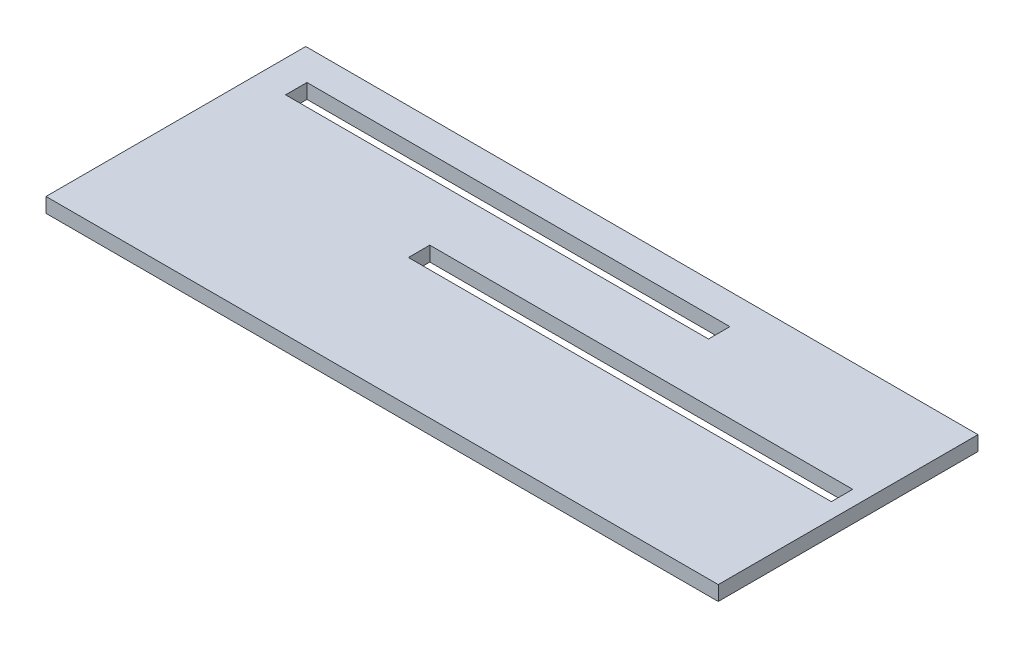
ISO-10303-21;
HEADER;
FILE_DESCRIPTION(('STEP AP214'),'2;1');
FILE_NAME('part.step','',(''),(''),'','','');
FILE_SCHEMA(('AUTOMOTIVE_DESIGN { 1 0 10303 214 1 1 1 1 }'));
ENDSEC;
DATA;
#1=APPLICATION_CONTEXT('core data for automotive mechanical design processes');
#2=APPLICATION_PROTOCOL_DEFINITION('international standard','automotive_design',2000,#1);
#3=PRODUCT_CONTEXT('',#1,'mechanical');
#4=PRODUCT('Part','Part','',(#3));
#5=PRODUCT_RELATED_PRODUCT_CATEGORY('part','',(#4));
#6=PRODUCT_DEFINITION_FORMATION('','',#4);
#7=PRODUCT_DEFINITION_CONTEXT('part definition',#1,'design');
#8=PRODUCT_DEFINITION('design','',#6,#7);
#9=PRODUCT_DEFINITION_SHAPE('','',#8);
#10=(LENGTH_UNIT() NAMED_UNIT(*) SI_UNIT(.MILLI.,.METRE.));
#11=(NAMED_UNIT(*) PLANE_ANGLE_UNIT() SI_UNIT($,.RADIAN.));
#12=(NAMED_UNIT(*) SI_UNIT($,.STERADIAN.) SOLID_ANGLE_UNIT());
#13=UNCERTAINTY_MEASURE_WITH_UNIT(LENGTH_MEASURE(1.E-05),#10,'distance_accuracy_value','');
#14=(GEOMETRIC_REPRESENTATION_CONTEXT(3) GLOBAL_UNCERTAINTY_ASSIGNED_CONTEXT((#13)) GLOBAL_UNIT_ASSIGNED_CONTEXT((#10,
#11,#12)) REPRESENTATION_CONTEXT('',''));
#15=CARTESIAN_POINT('',(0.,0.,0.));
#16=DIRECTION('',(0.,0.,1.));
#17=DIRECTION('',(1.,0.,0.));
#18=AXIS2_PLACEMENT_3D('',#15,#16,#17);
#19=CARTESIAN_POINT('',(0.,0.24,0.));
#20=DIRECTION('',(0.,-1.,0.));
#21=DIRECTION('',(0.,0.,-1.));
#22=AXIS2_PLACEMENT_3D('',#19,#20,#21);
#23=PLANE('',#22);
#24=DIRECTION('',(-1.,0.,0.));
#25=VECTOR('',#24,1.);
#26=CARTESIAN_POINT('',(7.44,0.24,-3.75));
#27=LINE('',#26,#25);
#28=CARTESIAN_POINT('',(7.44,0.24,-3.75));
#29=VERTEX_POINT('',#28);
#30=CARTESIAN_POINT('',(0.52,0.24,-3.75));
#31=VERTEX_POINT('',#30);
#32=EDGE_CURVE('E177',#29,#31,#27,.T.);
#33=ORIENTED_EDGE('',*,*,#32,.F.);
#34=DIRECTION('',(0.,0.,-1.));
#35=VECTOR('',#34,1.);
#36=CARTESIAN_POINT('',(7.44,0.24,-3.4));
#37=LINE('',#36,#35);
#38=CARTESIAN_POINT('',(7.44,0.24,-3.4));
#39=VERTEX_POINT('',#38);
#40=EDGE_CURVE('E188',#39,#29,#37,.T.);
#41=ORIENTED_EDGE('',*,*,#40,.F.);
#42=DIRECTION('',(1.,0.,0.));
#43=VECTOR('',#42,1.);
#44=CARTESIAN_POINT('',(0.52,0.24,-3.4));
#45=LINE('',#44,#43);
#46=CARTESIAN_POINT('',(0.52,0.24,-3.4));
#47=VERTEX_POINT('',#46);
#48=EDGE_CURVE('E184',#47,#39,#45,.T.);
#49=ORIENTED_EDGE('',*,*,#48,.F.);
#50=DIRECTION('',(0.,0.,1.));
#51=VECTOR('',#50,1.);
#52=CARTESIAN_POINT('',(0.52,0.24,-3.75));
#53=LINE('',#52,#51);
#54=EDGE_CURVE('E180',#31,#47,#53,.T.);
#55=ORIENTED_EDGE('',*,*,#54,.F.);
#56=EDGE_LOOP('',(#33,#41,#49,#55));
#57=FACE_BOUND('',#56,.T.);
#58=DIRECTION('',(1.,0.,0.));
#59=VECTOR('',#58,1.);
#60=CARTESIAN_POINT('',(11.,0.24,0.));
#61=LINE('',#60,#59);
#62=CARTESIAN_POINT('',(0.,0.24,0.));
#63=VERTEX_POINT('',#62);
#64=CARTESIAN_POINT('',(11.,0.24,0.));
#65=VERTEX_POINT('',#64);
#66=EDGE_CURVE('E220',#63,#65,#61,.T.);
#67=ORIENTED_EDGE('',*,*,#66,.T.);
#68=DIRECTION('',(0.,0.,-1.));
#69=VECTOR('',#68,1.);
#70=CARTESIAN_POINT('',(11.,0.24,-4.25));
#71=LINE('',#70,#69);
#72=CARTESIAN_POINT('',(11.,0.24,-4.25));
#73=VERTEX_POINT('',#72);
#74=EDGE_CURVE('E224',#65,#73,#71,.T.);
#75=ORIENTED_EDGE('',*,*,#74,.T.);
#76=DIRECTION('',(-1.,0.,0.));
#77=VECTOR('',#76,1.);
#78=CARTESIAN_POINT('',(0.,0.24,-4.25));
#79=LINE('',#78,#77);
#80=CARTESIAN_POINT('',(0.,0.24,-4.25));
#81=VERTEX_POINT('',#80);
#82=EDGE_CURVE('E228',#73,#81,#79,.T.);
#83=ORIENTED_EDGE('',*,*,#82,.T.);
#84=DIRECTION('',(0.,0.,1.));
#85=VECTOR('',#84,1.);
#86=CARTESIAN_POINT('',(0.,0.24,0.));
#87=LINE('',#86,#85);
#88=EDGE_CURVE('E231',#81,#63,#87,.T.);
#89=ORIENTED_EDGE('',*,*,#88,.T.);
#90=EDGE_LOOP('',(#67,#75,#83,#89));
#91=FACE_BOUND('',#90,.T.);
#92=DIRECTION('',(-1.,0.,0.));
#93=VECTOR('',#92,1.);
#94=CARTESIAN_POINT('',(10.75,0.24,-2.45));
#95=LINE('',#94,#93);
#96=CARTESIAN_POINT('',(10.75,0.24,-2.45));
#97=VERTEX_POINT('',#96);
#98=CARTESIAN_POINT('',(3.83,0.24,-2.45));
#99=VERTEX_POINT('',#98);
#100=EDGE_CURVE('E129',#97,#99,#95,.T.);
#101=ORIENTED_EDGE('',*,*,#100,.F.);
#102=DIRECTION('',(0.,0.,-1.));
#103=VECTOR('',#102,1.);
#104=CARTESIAN_POINT('',(10.75,0.24,-2.1));
#105=LINE('',#104,#103);
#106=CARTESIAN_POINT('',(10.75,0.24,-2.1));
#107=VERTEX_POINT('',#106);
#108=EDGE_CURVE('E155',#107,#97,#105,.T.);
#109=ORIENTED_EDGE('',*,*,#108,.F.);
#110=DIRECTION('',(1.,0.,0.));
#111=VECTOR('',#110,1.);
#112=CARTESIAN_POINT('',(3.83,0.24,-2.1));
#113=LINE('',#112,#111);
#114=CARTESIAN_POINT('',(3.83,0.24,-2.1));
#115=VERTEX_POINT('',#114);
#116=EDGE_CURVE('E151',#115,#107,#113,.T.);
#117=ORIENTED_EDGE('',*,*,#116,.F.);
#118=DIRECTION('',(0.,0.,1.));
#119=VECTOR('',#118,1.);
#120=CARTESIAN_POINT('',(3.83,0.24,-2.45));
#121=LINE('',#120,#119);
#122=EDGE_CURVE('E138',#99,#115,#121,.T.);
#123=ORIENTED_EDGE('',*,*,#122,.F.);
#124=EDGE_LOOP('',(#101,#109,#117,#123));
#125=FACE_BOUND('',#124,.T.);
#126=ADVANCED_FACE('F39',(#57,#91,#125),#23,.F.);
#127=CARTESIAN_POINT('',(0.,0.,0.));
#128=DIRECTION('',(0.,-1.,0.));
#129=DIRECTION('',(0.,0.,-1.));
#130=AXIS2_PLACEMENT_3D('',#127,#128,#129);
#131=PLANE('',#130);
#132=DIRECTION('',(1.,0.,0.));
#133=VECTOR('',#132,1.);
#134=CARTESIAN_POINT('',(11.,0.,0.));
#135=LINE('',#134,#133);
#136=CARTESIAN_POINT('',(0.,0.,0.));
#137=VERTEX_POINT('',#136);
#138=CARTESIAN_POINT('',(11.,0.,0.));
#139=VERTEX_POINT('',#138);
#140=EDGE_CURVE('E219',#137,#139,#135,.T.);
#141=ORIENTED_EDGE('',*,*,#140,.F.);
#142=DIRECTION('',(0.,0.,1.));
#143=VECTOR('',#142,1.);
#144=CARTESIAN_POINT('',(0.,0.,0.));
#145=LINE('',#144,#143);
#146=CARTESIAN_POINT('',(0.,0.,-4.25));
#147=VERTEX_POINT('',#146);
#148=EDGE_CURVE('E225',#147,#137,#145,.T.);
#149=ORIENTED_EDGE('',*,*,#148,.F.);
#150=DIRECTION('',(-1.,0.,0.));
#151=VECTOR('',#150,1.);
#152=CARTESIAN_POINT('',(0.,0.,-4.25));
#153=LINE('',#152,#151);
#154=CARTESIAN_POINT('',(11.,0.,-4.25));
#155=VERTEX_POINT('',#154);
#156=EDGE_CURVE('E241',#155,#147,#153,.T.);
#157=ORIENTED_EDGE('',*,*,#156,.F.);
#158=DIRECTION('',(0.,0.,-1.));
#159=VECTOR('',#158,1.);
#160=CARTESIAN_POINT('',(11.,0.,-4.25));
#161=LINE('',#160,#159);
#162=EDGE_CURVE('E238',#139,#155,#161,.T.);
#163=ORIENTED_EDGE('',*,*,#162,.F.);
#164=EDGE_LOOP('',(#141,#149,#157,#163));
#165=FACE_BOUND('',#164,.T.);
#166=DIRECTION('',(0.,0.,-1.));
#167=VECTOR('',#166,1.);
#168=CARTESIAN_POINT('',(7.44,0.,-3.4));
#169=LINE('',#168,#167);
#170=CARTESIAN_POINT('',(7.44,0.,-3.4));
#171=VERTEX_POINT('',#170);
#172=CARTESIAN_POINT('',(7.44,0.,-3.75));
#173=VERTEX_POINT('',#172);
#174=EDGE_CURVE('E181',#171,#173,#169,.T.);
#175=ORIENTED_EDGE('',*,*,#174,.T.);
#176=DIRECTION('',(-1.,0.,0.));
#177=VECTOR('',#176,1.);
#178=CARTESIAN_POINT('',(7.44,0.,-3.75));
#179=LINE('',#178,#177);
#180=CARTESIAN_POINT('',(0.52,0.,-3.75));
#181=VERTEX_POINT('',#180);
#182=EDGE_CURVE('E147',#173,#181,#179,.T.);
#183=ORIENTED_EDGE('',*,*,#182,.T.);
#184=DIRECTION('',(0.,0.,1.));
#185=VECTOR('',#184,1.);
#186=CARTESIAN_POINT('',(0.52,0.,-3.75));
#187=LINE('',#186,#185);
#188=CARTESIAN_POINT('',(0.52,0.,-3.4));
#189=VERTEX_POINT('',#188);
#190=EDGE_CURVE('E195',#181,#189,#187,.T.);
#191=ORIENTED_EDGE('',*,*,#190,.T.);
#192=DIRECTION('',(1.,0.,0.));
#193=VECTOR('',#192,1.);
#194=CARTESIAN_POINT('',(0.52,0.,-3.4));
#195=LINE('',#194,#193);
#196=EDGE_CURVE('E199',#189,#171,#195,.T.);
#197=ORIENTED_EDGE('',*,*,#196,.T.);
#198=EDGE_LOOP('',(#175,#183,#191,#197));
#199=FACE_BOUND('',#198,.T.);
#200=DIRECTION('',(0.,0.,-1.));
#201=VECTOR('',#200,1.);
#202=CARTESIAN_POINT('',(10.75,0.,-2.1));
#203=LINE('',#202,#201);
#204=CARTESIAN_POINT('',(10.75,0.,-2.1));
#205=VERTEX_POINT('',#204);
#206=CARTESIAN_POINT('',(10.75,0.,-2.45));
#207=VERTEX_POINT('',#206);
#208=EDGE_CURVE('E139',#205,#207,#203,.T.);
#209=ORIENTED_EDGE('',*,*,#208,.T.);
#210=DIRECTION('',(-1.,0.,0.));
#211=VECTOR('',#210,1.);
#212=CARTESIAN_POINT('',(10.75,0.,-2.45));
#213=LINE('',#212,#211);
#214=CARTESIAN_POINT('',(3.83,0.,-2.45));
#215=VERTEX_POINT('',#214);
#216=EDGE_CURVE('E63',#207,#215,#213,.T.);
#217=ORIENTED_EDGE('',*,*,#216,.T.);
#218=DIRECTION('',(0.,0.,1.));
#219=VECTOR('',#218,1.);
#220=CARTESIAN_POINT('',(3.83,0.,-2.45));
#221=LINE('',#220,#219);
#222=CARTESIAN_POINT('',(3.83,0.,-2.1));
#223=VERTEX_POINT('',#222);
#224=EDGE_CURVE('E145',#215,#223,#221,.T.);
#225=ORIENTED_EDGE('',*,*,#224,.T.);
#226=DIRECTION('',(1.,0.,0.));
#227=VECTOR('',#226,1.);
#228=CARTESIAN_POINT('',(3.83,0.,-2.1));
#229=LINE('',#228,#227);
#230=EDGE_CURVE('E164',#223,#205,#229,.T.);
#231=ORIENTED_EDGE('',*,*,#230,.T.);
#232=EDGE_LOOP('',(#209,#217,#225,#231));
#233=FACE_BOUND('',#232,.T.);
#234=ADVANCED_FACE('F264',(#165,#199,#233),#131,.T.);
#235=CARTESIAN_POINT('',(11.,0.24,0.));
#236=DIRECTION('',(0.,0.,-1.));
#237=DIRECTION('',(-1.,0.,0.));
#238=AXIS2_PLACEMENT_3D('',#235,#236,#237);
#239=PLANE('',#238);
#240=ORIENTED_EDGE('',*,*,#140,.T.);
#241=DIRECTION('',(0.,-1.,0.));
#242=VECTOR('',#241,1.);
#243=CARTESIAN_POINT('',(11.,0.24,0.));
#244=LINE('',#243,#242);
#245=EDGE_CURVE('E11',#65,#139,#244,.T.);
#246=ORIENTED_EDGE('',*,*,#245,.F.);
#247=ORIENTED_EDGE('',*,*,#66,.F.);
#248=DIRECTION('',(0.,-1.,0.));
#249=VECTOR('',#248,1.);
#250=CARTESIAN_POINT('',(0.,0.24,0.));
#251=LINE('',#250,#249);
#252=EDGE_CURVE('E234',#63,#137,#251,.T.);
#253=ORIENTED_EDGE('',*,*,#252,.T.);
#254=EDGE_LOOP('',(#240,#246,#247,#253));
#255=FACE_BOUND('',#254,.T.);
#256=ADVANCED_FACE('F41',(#255),#239,.F.);
#257=CARTESIAN_POINT('',(11.,0.24,-4.25));
#258=DIRECTION('',(-1.,0.,0.));
#259=DIRECTION('',(0.,0.,1.));
#260=AXIS2_PLACEMENT_3D('',#257,#258,#259);
#261=PLANE('',#260);
#262=ORIENTED_EDGE('',*,*,#162,.T.);
#263=DIRECTION('',(0.,-1.,0.));
#264=VECTOR('',#263,1.);
#265=CARTESIAN_POINT('',(11.,0.24,-4.25));
#266=LINE('',#265,#264);
#267=EDGE_CURVE('E48',#73,#155,#266,.T.);
#268=ORIENTED_EDGE('',*,*,#267,.F.);
#269=ORIENTED_EDGE('',*,*,#74,.F.);
#270=ORIENTED_EDGE('',*,*,#245,.T.);
#271=EDGE_LOOP('',(#262,#268,#269,#270));
#272=FACE_BOUND('',#271,.T.);
#273=ADVANCED_FACE('F274',(#272),#261,.F.);
#274=CARTESIAN_POINT('',(0.,0.24,-4.25));
#275=DIRECTION('',(0.,0.,1.));
#276=DIRECTION('',(1.,0.,0.));
#277=AXIS2_PLACEMENT_3D('',#274,#275,#276);
#278=PLANE('',#277);
#279=ORIENTED_EDGE('',*,*,#156,.T.);
#280=DIRECTION('',(0.,-1.,0.));
#281=VECTOR('',#280,1.);
#282=CARTESIAN_POINT('',(0.,0.24,-4.25));
#283=LINE('',#282,#281);
#284=EDGE_CURVE('E249',#81,#147,#283,.T.);
#285=ORIENTED_EDGE('',*,*,#284,.F.);
#286=ORIENTED_EDGE('',*,*,#82,.F.);
#287=ORIENTED_EDGE('',*,*,#267,.T.);
#288=EDGE_LOOP('',(#279,#285,#286,#287));
#289=FACE_BOUND('',#288,.T.);
#290=ADVANCED_FACE('F258',(#289),#278,.F.);
#291=CARTESIAN_POINT('',(0.,0.24,0.));
#292=DIRECTION('',(1.,0.,0.));
#293=DIRECTION('',(0.,0.,-1.));
#294=AXIS2_PLACEMENT_3D('',#291,#292,#293);
#295=PLANE('',#294);
#296=ORIENTED_EDGE('',*,*,#148,.T.);
#297=ORIENTED_EDGE('',*,*,#252,.F.);
#298=ORIENTED_EDGE('',*,*,#88,.F.);
#299=ORIENTED_EDGE('',*,*,#284,.T.);
#300=EDGE_LOOP('',(#296,#297,#298,#299));
#301=FACE_BOUND('',#300,.T.);
#302=ADVANCED_FACE('F268',(#301),#295,.F.);
#303=CARTESIAN_POINT('',(7.44,0.24,-3.75));
#304=DIRECTION('',(0.,0.,1.));
#305=DIRECTION('',(1.,0.,0.));
#306=AXIS2_PLACEMENT_3D('',#303,#304,#305);
#307=PLANE('',#306);
#308=ORIENTED_EDGE('',*,*,#182,.F.);
#309=DIRECTION('',(0.,-1.,0.));
#310=VECTOR('',#309,1.);
#311=CARTESIAN_POINT('',(7.44,0.24,-3.75));
#312=LINE('',#311,#310);
#313=EDGE_CURVE('E191',#29,#173,#312,.T.);
#314=ORIENTED_EDGE('',*,*,#313,.F.);
#315=ORIENTED_EDGE('',*,*,#32,.T.);
#316=DIRECTION('',(0.,-1.,0.));
#317=VECTOR('',#316,1.);
#318=CARTESIAN_POINT('',(0.52,0.24,-3.75));
#319=LINE('',#318,#317);
#320=EDGE_CURVE('E215',#31,#181,#319,.T.);
#321=ORIENTED_EDGE('',*,*,#320,.T.);
#322=EDGE_LOOP('',(#308,#314,#315,#321));
#323=FACE_BOUND('',#322,.T.);
#324=ADVANCED_FACE('F290',(#323),#307,.T.);
#325=CARTESIAN_POINT('',(0.52,0.24,-3.75));
#326=DIRECTION('',(1.,0.,0.));
#327=DIRECTION('',(0.,0.,-1.));
#328=AXIS2_PLACEMENT_3D('',#325,#326,#327);
#329=PLANE('',#328);
#330=ORIENTED_EDGE('',*,*,#190,.F.);
#331=ORIENTED_EDGE('',*,*,#320,.F.);
#332=ORIENTED_EDGE('',*,*,#54,.T.);
#333=DIRECTION('',(0.,-1.,0.));
#334=VECTOR('',#333,1.);
#335=CARTESIAN_POINT('',(0.52,0.24,-3.4));
#336=LINE('',#335,#334);
#337=EDGE_CURVE('E212',#47,#189,#336,.T.);
#338=ORIENTED_EDGE('',*,*,#337,.T.);
#339=EDGE_LOOP('',(#330,#331,#332,#338));
#340=FACE_BOUND('',#339,.T.);
#341=ADVANCED_FACE('F297',(#340),#329,.T.);
#342=CARTESIAN_POINT('',(0.52,0.24,-3.4));
#343=DIRECTION('',(0.,0.,-1.));
#344=DIRECTION('',(-1.,0.,0.));
#345=AXIS2_PLACEMENT_3D('',#342,#343,#344);
#346=PLANE('',#345);
#347=ORIENTED_EDGE('',*,*,#196,.F.);
#348=ORIENTED_EDGE('',*,*,#337,.F.);
#349=ORIENTED_EDGE('',*,*,#48,.T.);
#350=DIRECTION('',(0.,-1.,0.));
#351=VECTOR('',#350,1.);
#352=CARTESIAN_POINT('',(7.44,0.24,-3.4));
#353=LINE('',#352,#351);
#354=EDGE_CURVE('E209',#39,#171,#353,.T.);
#355=ORIENTED_EDGE('',*,*,#354,.T.);
#356=EDGE_LOOP('',(#347,#348,#349,#355));
#357=FACE_BOUND('',#356,.T.);
#358=ADVANCED_FACE('F302',(#357),#346,.T.);
#359=CARTESIAN_POINT('',(7.44,0.24,-3.4));
#360=DIRECTION('',(-1.,0.,0.));
#361=DIRECTION('',(0.,0.,1.));
#362=AXIS2_PLACEMENT_3D('',#359,#360,#361);
#363=PLANE('',#362);
#364=ORIENTED_EDGE('',*,*,#174,.F.);
#365=ORIENTED_EDGE('',*,*,#354,.F.);
#366=ORIENTED_EDGE('',*,*,#40,.T.);
#367=ORIENTED_EDGE('',*,*,#313,.T.);
#368=EDGE_LOOP('',(#364,#365,#366,#367));
#369=FACE_BOUND('',#368,.T.);
#370=ADVANCED_FACE('F308',(#369),#363,.T.);
#371=CARTESIAN_POINT('',(10.75,0.24,-2.45));
#372=DIRECTION('',(0.,0.,1.));
#373=DIRECTION('',(1.,0.,0.));
#374=AXIS2_PLACEMENT_3D('',#371,#372,#373);
#375=PLANE('',#374);
#376=ORIENTED_EDGE('',*,*,#216,.F.);
#377=DIRECTION('',(0.,-1.,0.));
#378=VECTOR('',#377,1.);
#379=CARTESIAN_POINT('',(10.75,0.24,-2.45));
#380=LINE('',#379,#378);
#381=EDGE_CURVE('E133',#97,#207,#380,.T.);
#382=ORIENTED_EDGE('',*,*,#381,.F.);
#383=ORIENTED_EDGE('',*,*,#100,.T.);
#384=DIRECTION('',(0.,-1.,0.));
#385=VECTOR('',#384,1.);
#386=CARTESIAN_POINT('',(3.83,0.24,-2.45));
#387=LINE('',#386,#385);
#388=EDGE_CURVE('E132',#99,#215,#387,.T.);
#389=ORIENTED_EDGE('',*,*,#388,.T.);
#390=EDGE_LOOP('',(#376,#382,#383,#389));
#391=FACE_BOUND('',#390,.T.);
#392=ADVANCED_FACE('F131',(#391),#375,.T.);
#393=CARTESIAN_POINT('',(3.83,0.24,-2.45));
#394=DIRECTION('',(1.,0.,0.));
#395=DIRECTION('',(0.,0.,-1.));
#396=AXIS2_PLACEMENT_3D('',#393,#394,#395);
#397=PLANE('',#396);
#398=ORIENTED_EDGE('',*,*,#224,.F.);
#399=ORIENTED_EDGE('',*,*,#388,.F.);
#400=ORIENTED_EDGE('',*,*,#122,.T.);
#401=DIRECTION('',(0.,-1.,0.));
#402=VECTOR('',#401,1.);
#403=CARTESIAN_POINT('',(3.83,0.24,-2.1));
#404=LINE('',#403,#402);
#405=EDGE_CURVE('E148',#115,#223,#404,.T.);
#406=ORIENTED_EDGE('',*,*,#405,.T.);
#407=EDGE_LOOP('',(#398,#399,#400,#406));
#408=FACE_BOUND('',#407,.T.);
#409=ADVANCED_FACE('F142',(#408),#397,.T.);
#410=CARTESIAN_POINT('',(3.83,0.24,-2.1));
#411=DIRECTION('',(0.,0.,-1.));
#412=DIRECTION('',(-1.,0.,0.));
#413=AXIS2_PLACEMENT_3D('',#410,#411,#412);
#414=PLANE('',#413);
#415=ORIENTED_EDGE('',*,*,#230,.F.);
#416=ORIENTED_EDGE('',*,*,#405,.F.);
#417=ORIENTED_EDGE('',*,*,#116,.T.);
#418=DIRECTION('',(0.,-1.,0.));
#419=VECTOR('',#418,1.);
#420=CARTESIAN_POINT('',(10.75,0.24,-2.1));
#421=LINE('',#420,#419);
#422=EDGE_CURVE('E55',#107,#205,#421,.T.);
#423=ORIENTED_EDGE('',*,*,#422,.T.);
#424=EDGE_LOOP('',(#415,#416,#417,#423));
#425=FACE_BOUND('',#424,.T.);
#426=ADVANCED_FACE('F327',(#425),#414,.T.);
#427=CARTESIAN_POINT('',(10.75,0.24,-2.1));
#428=DIRECTION('',(-1.,0.,0.));
#429=DIRECTION('',(0.,0.,1.));
#430=AXIS2_PLACEMENT_3D('',#427,#428,#429);
#431=PLANE('',#430);
#432=ORIENTED_EDGE('',*,*,#208,.F.);
#433=ORIENTED_EDGE('',*,*,#422,.F.);
#434=ORIENTED_EDGE('',*,*,#108,.T.);
#435=ORIENTED_EDGE('',*,*,#381,.T.);
#436=EDGE_LOOP('',(#432,#433,#434,#435));
#437=FACE_BOUND('',#436,.T.);
#438=ADVANCED_FACE('F330',(#437),#431,.T.);
#439=CLOSED_SHELL('',(#126,#234,#256,#273,#290,#302,#324,#341,#358,#370,#392,#409,#426,#438));
#440=MANIFOLD_SOLID_BREP('B2',#439);
#441=ADVANCED_BREP_SHAPE_REPRESENTATION('',(#18,#440),#14);
#442=SHAPE_DEFINITION_REPRESENTATION(#9,#441);
ENDSEC;
END-ISO-10303-21;
